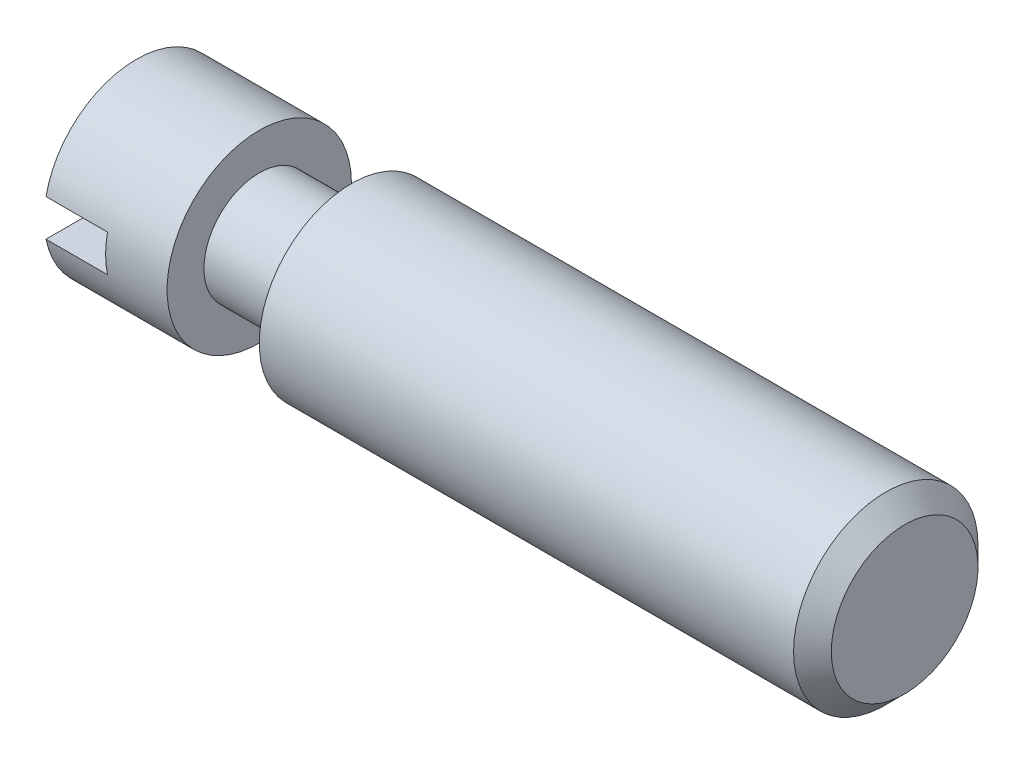
ISO-10303-21;
HEADER;
FILE_DESCRIPTION(('STEP AP214'),'2;1');
FILE_NAME('part.step','',(''),(''),'','','');
FILE_SCHEMA(('AUTOMOTIVE_DESIGN { 1 0 10303 214 1 1 1 1 }'));
ENDSEC;
DATA;
#1=APPLICATION_CONTEXT('core data for automotive mechanical design processes');
#2=APPLICATION_PROTOCOL_DEFINITION('international standard','automotive_design',2000,#1);
#3=PRODUCT_CONTEXT('',#1,'mechanical');
#4=PRODUCT('Part','Part','',(#3));
#5=PRODUCT_RELATED_PRODUCT_CATEGORY('part','',(#4));
#6=PRODUCT_DEFINITION_FORMATION('','',#4);
#7=PRODUCT_DEFINITION_CONTEXT('part definition',#1,'design');
#8=PRODUCT_DEFINITION('design','',#6,#7);
#9=PRODUCT_DEFINITION_SHAPE('','',#8);
#10=(LENGTH_UNIT() NAMED_UNIT(*) SI_UNIT(.MILLI.,.METRE.));
#11=(NAMED_UNIT(*) PLANE_ANGLE_UNIT() SI_UNIT($,.RADIAN.));
#12=(NAMED_UNIT(*) SI_UNIT($,.STERADIAN.) SOLID_ANGLE_UNIT());
#13=UNCERTAINTY_MEASURE_WITH_UNIT(LENGTH_MEASURE(1.E-05),#10,'distance_accuracy_value','');
#14=(GEOMETRIC_REPRESENTATION_CONTEXT(3) GLOBAL_UNCERTAINTY_ASSIGNED_CONTEXT((#13)) GLOBAL_UNIT_ASSIGNED_CONTEXT((#10,
#11,#12)) REPRESENTATION_CONTEXT('',''));
#15=CARTESIAN_POINT('',(0.,0.,0.));
#16=DIRECTION('',(0.,0.,1.));
#17=DIRECTION('',(1.,0.,0.));
#18=AXIS2_PLACEMENT_3D('',#15,#16,#17);
#19=CARTESIAN_POINT('',(2.,-0.6,3.));
#20=DIRECTION('',(1.,0.,0.));
#21=DIRECTION('',(0.,0.,-1.));
#22=AXIS2_PLACEMENT_3D('',#19,#20,#21);
#23=PLANE('',#22);
#24=DIRECTION('',(0.,0.,-1.));
#25=VECTOR('',#24,1.);
#26=CARTESIAN_POINT('',(2.,-0.6,3.));
#27=LINE('',#26,#25);
#28=CARTESIAN_POINT('',(2.,-0.600000000000001,-2.93938769133981));
#29=VERTEX_POINT('',#28);
#30=CARTESIAN_POINT('',(2.,-0.6,2.93938769133981));
#31=VERTEX_POINT('',#30);
#32=EDGE_CURVE('E60',#29,#31,#27,.F.);
#33=ORIENTED_EDGE('',*,*,#32,.T.);
#34=CARTESIAN_POINT('',(2.,0.,0.));
#35=DIRECTION('',(1.,0.,0.));
#36=DIRECTION('',(0.,0.,-1.));
#37=AXIS2_PLACEMENT_3D('',#34,#35,#36);
#38=CIRCLE('',#37,3.);
#39=CARTESIAN_POINT('',(2.,0.6,2.93938769133981));
#40=VERTEX_POINT('',#39);
#41=EDGE_CURVE('E19',#40,#31,#38,.T.);
#42=ORIENTED_EDGE('',*,*,#41,.F.);
#43=DIRECTION('',(0.,0.,1.));
#44=VECTOR('',#43,1.);
#45=CARTESIAN_POINT('',(2.,0.6,3.));
#46=LINE('',#45,#44);
#47=CARTESIAN_POINT('',(2.,0.6,-2.93938769133981));
#48=VERTEX_POINT('',#47);
#49=EDGE_CURVE('E57',#40,#48,#46,.F.);
#50=ORIENTED_EDGE('',*,*,#49,.T.);
#51=CARTESIAN_POINT('',(2.,0.,0.));
#52=DIRECTION('',(1.,0.,0.));
#53=DIRECTION('',(0.,0.,-1.));
#54=AXIS2_PLACEMENT_3D('',#51,#52,#53);
#55=CIRCLE('',#54,3.);
#56=EDGE_CURVE('E64',#29,#48,#55,.T.);
#57=ORIENTED_EDGE('',*,*,#56,.F.);
#58=EDGE_LOOP('',(#33,#42,#50,#57));
#59=FACE_BOUND('',#58,.T.);
#60=ADVANCED_FACE('F16',(#59),#23,.F.);
#61=CARTESIAN_POINT('',(0.,1.5,0.));
#62=DIRECTION('',(-1.,0.,0.));
#63=DIRECTION('',(0.,0.,1.));
#64=AXIS2_PLACEMENT_3D('',#61,#62,#63);
#65=PLANE('',#64);
#66=CARTESIAN_POINT('',(0.,0.,0.));
#67=DIRECTION('',(1.,0.,0.));
#68=DIRECTION('',(0.,0.,-1.));
#69=AXIS2_PLACEMENT_3D('',#66,#67,#68);
#70=CIRCLE('',#69,3.);
#71=CARTESIAN_POINT('',(0.,0.600000000000001,-2.93938769133981));
#72=VERTEX_POINT('',#71);
#73=CARTESIAN_POINT('',(0.,0.6,2.93938769133981));
#74=VERTEX_POINT('',#73);
#75=EDGE_CURVE('E77',#72,#74,#70,.T.);
#76=ORIENTED_EDGE('',*,*,#75,.F.);
#77=DIRECTION('',(0.,0.,1.));
#78=VECTOR('',#77,1.);
#79=CARTESIAN_POINT('',(0.,0.6,3.));
#80=LINE('',#79,#78);
#81=EDGE_CURVE('E73',#72,#74,#80,.T.);
#82=ORIENTED_EDGE('',*,*,#81,.T.);
#83=EDGE_LOOP('',(#76,#82));
#84=FACE_BOUND('',#83,.T.);
#85=ADVANCED_FACE('F204',(#84),#65,.T.);
#86=CARTESIAN_POINT('',(2.,0.6,3.));
#87=DIRECTION('',(0.,1.,0.));
#88=DIRECTION('',(0.,0.,1.));
#89=AXIS2_PLACEMENT_3D('',#86,#87,#88);
#90=PLANE('',#89);
#91=ORIENTED_EDGE('',*,*,#49,.F.);
#92=DIRECTION('',(1.,0.,0.));
#93=VECTOR('',#92,1.);
#94=CARTESIAN_POINT('',(12.19325,0.600000000000001,2.93938769133981));
#95=LINE('',#94,#93);
#96=EDGE_CURVE('E69',#74,#40,#95,.T.);
#97=ORIENTED_EDGE('',*,*,#96,.F.);
#98=ORIENTED_EDGE('',*,*,#81,.F.);
#99=DIRECTION('',(1.,0.,0.));
#100=VECTOR('',#99,1.);
#101=CARTESIAN_POINT('',(12.19325,0.600000000000001,-2.93938769133981));
#102=LINE('',#101,#100);
#103=EDGE_CURVE('E72',#48,#72,#102,.F.);
#104=ORIENTED_EDGE('',*,*,#103,.F.);
#105=EDGE_LOOP('',(#91,#97,#98,#104));
#106=FACE_BOUND('',#105,.T.);
#107=ADVANCED_FACE('F67',(#106),#90,.F.);
#108=CARTESIAN_POINT('',(0.,-0.6,3.));
#109=DIRECTION('',(0.,-1.,0.));
#110=DIRECTION('',(0.,0.,-1.));
#111=AXIS2_PLACEMENT_3D('',#108,#109,#110);
#112=PLANE('',#111);
#113=DIRECTION('',(0.,0.,1.));
#114=VECTOR('',#113,1.);
#115=CARTESIAN_POINT('',(0.,-0.6,0.));
#116=LINE('',#115,#114);
#117=CARTESIAN_POINT('',(0.,-0.6,2.93938769133981));
#118=VERTEX_POINT('',#117);
#119=CARTESIAN_POINT('',(0.,-0.6,-2.93938769133981));
#120=VERTEX_POINT('',#119);
#121=EDGE_CURVE('E33',#118,#120,#116,.F.);
#122=ORIENTED_EDGE('',*,*,#121,.F.);
#123=DIRECTION('',(1.,0.,0.));
#124=VECTOR('',#123,1.);
#125=CARTESIAN_POINT('',(12.19325,-0.6,2.93938769133981));
#126=LINE('',#125,#124);
#127=EDGE_CURVE('E78',#31,#118,#126,.F.);
#128=ORIENTED_EDGE('',*,*,#127,.F.);
#129=ORIENTED_EDGE('',*,*,#32,.F.);
#130=DIRECTION('',(1.,0.,0.));
#131=VECTOR('',#130,1.);
#132=CARTESIAN_POINT('',(12.19325,-0.600000000000001,-2.93938769133981));
#133=LINE('',#132,#131);
#134=EDGE_CURVE('E86',#120,#29,#133,.T.);
#135=ORIENTED_EDGE('',*,*,#134,.F.);
#136=EDGE_LOOP('',(#122,#128,#129,#135));
#137=FACE_BOUND('',#136,.T.);
#138=ADVANCED_FACE('F102',(#137),#112,.F.);
#139=CARTESIAN_POINT('',(0.,1.5,0.));
#140=DIRECTION('',(-1.,0.,0.));
#141=DIRECTION('',(0.,0.,1.));
#142=AXIS2_PLACEMENT_3D('',#139,#140,#141);
#143=PLANE('',#142);
#144=ORIENTED_EDGE('',*,*,#121,.T.);
#145=CARTESIAN_POINT('',(0.,0.,0.));
#146=DIRECTION('',(1.,0.,0.));
#147=DIRECTION('',(0.,0.,-1.));
#148=AXIS2_PLACEMENT_3D('',#145,#146,#147);
#149=CIRCLE('',#148,3.);
#150=EDGE_CURVE('E80',#118,#120,#149,.T.);
#151=ORIENTED_EDGE('',*,*,#150,.F.);
#152=EDGE_LOOP('',(#144,#151));
#153=FACE_BOUND('',#152,.T.);
#154=ADVANCED_FACE('F179',(#153),#143,.T.);
#155=CARTESIAN_POINT('',(12.19325,0.,0.));
#156=DIRECTION('',(1.,0.,0.));
#157=DIRECTION('',(0.,0.,-1.));
#158=AXIS2_PLACEMENT_3D('',#155,#156,#157);
#159=CYLINDRICAL_SURFACE('',#158,3.);
#160=ORIENTED_EDGE('',*,*,#103,.T.);
#161=ORIENTED_EDGE('',*,*,#75,.T.);
#162=ORIENTED_EDGE('',*,*,#96,.T.);
#163=ORIENTED_EDGE('',*,*,#41,.T.);
#164=ORIENTED_EDGE('',*,*,#127,.T.);
#165=ORIENTED_EDGE('',*,*,#150,.T.);
#166=ORIENTED_EDGE('',*,*,#134,.T.);
#167=ORIENTED_EDGE('',*,*,#56,.T.);
#168=EDGE_LOOP('',(#160,#161,#162,#163,#164,#165,#166,#167));
#169=FACE_BOUND('',#168,.T.);
#170=CARTESIAN_POINT('',(4.,0.,0.));
#171=DIRECTION('',(1.,0.,0.));
#172=DIRECTION('',(0.,0.,-1.));
#173=AXIS2_PLACEMENT_3D('',#170,#171,#172);
#174=CIRCLE('',#173,3.);
#175=CARTESIAN_POINT('',(4.,0.,-3.));
#176=VERTEX_POINT('',#175);
#177=EDGE_CURVE('E99',#176,#176,#174,.F.);
#178=ORIENTED_EDGE('',*,*,#177,.T.);
#179=EDGE_LOOP('',(#178));
#180=FACE_BOUND('',#179,.T.);
#181=ADVANCED_FACE('F75',(#169,#180),#159,.T.);
#182=CARTESIAN_POINT('',(4.,3.3,0.));
#183=DIRECTION('',(-1.,0.,0.));
#184=DIRECTION('',(0.,0.,1.));
#185=AXIS2_PLACEMENT_3D('',#182,#183,#184);
#186=PLANE('',#185);
#187=CARTESIAN_POINT('',(4.,0.,0.));
#188=DIRECTION('',(1.,0.,0.));
#189=DIRECTION('',(0.,0.,-1.));
#190=AXIS2_PLACEMENT_3D('',#187,#188,#189);
#191=CIRCLE('',#190,1.8);
#192=CARTESIAN_POINT('',(4.,0.,-1.8));
#193=VERTEX_POINT('',#192);
#194=EDGE_CURVE('E96',#193,#193,#191,.T.);
#195=ORIENTED_EDGE('',*,*,#194,.F.);
#196=EDGE_LOOP('',(#195));
#197=FACE_BOUND('',#196,.T.);
#198=ORIENTED_EDGE('',*,*,#177,.F.);
#199=EDGE_LOOP('',(#198));
#200=FACE_BOUND('',#199,.T.);
#201=ADVANCED_FACE('F160',(#197,#200),#186,.F.);
#202=CARTESIAN_POINT('',(25.,1.19325,0.));
#203=DIRECTION('',(1.,0.,0.));
#204=DIRECTION('',(0.,0.,-1.));
#205=AXIS2_PLACEMENT_3D('',#202,#203,#204);
#206=PLANE('',#205);
#207=CARTESIAN_POINT('',(24.9999999999204,0.,0.));
#208=DIRECTION('',(-1.,0.,0.));
#209=DIRECTION('',(0.,0.,1.));
#210=AXIS2_PLACEMENT_3D('',#207,#208,#209);
#211=CIRCLE('',#210,2.38650000000007);
#212=CARTESIAN_POINT('',(24.9999999999204,0.,2.38650000000007));
#213=VERTEX_POINT('',#212);
#214=EDGE_CURVE('E93',#213,#213,#211,.T.);
#215=ORIENTED_EDGE('',*,*,#214,.F.);
#216=EDGE_LOOP('',(#215));
#217=FACE_BOUND('',#216,.T.);
#218=ADVANCED_FACE('F125',(#217),#206,.T.);
#219=CARTESIAN_POINT('',(5.5,0.,0.));
#220=DIRECTION('',(1.,0.,0.));
#221=DIRECTION('',(0.,0.,-1.));
#222=AXIS2_PLACEMENT_3D('',#219,#220,#221);
#223=CYLINDRICAL_SURFACE('',#222,1.8);
#224=CARTESIAN_POINT('',(7.,0.,0.));
#225=DIRECTION('',(1.,0.,0.));
#226=DIRECTION('',(0.,0.,-1.));
#227=AXIS2_PLACEMENT_3D('',#224,#225,#226);
#228=CIRCLE('',#227,1.8);
#229=CARTESIAN_POINT('',(7.,0.,-1.8));
#230=VERTEX_POINT('',#229);
#231=EDGE_CURVE('E90',#230,#230,#228,.F.);
#232=ORIENTED_EDGE('',*,*,#231,.T.);
#233=EDGE_LOOP('',(#232));
#234=FACE_BOUND('',#233,.T.);
#235=ORIENTED_EDGE('',*,*,#194,.T.);
#236=EDGE_LOOP('',(#235));
#237=FACE_BOUND('',#236,.T.);
#238=ADVANCED_FACE('F115',(#234,#237),#223,.T.);
#239=CARTESIAN_POINT('',(24.3864999999914,0.,0.));
#240=DIRECTION('',(-1.,0.,0.));
#241=DIRECTION('',(0.,0.,1.));
#242=AXIS2_PLACEMENT_3D('',#239,#240,#241);
#243=CONICAL_SURFACE('',#242,2.9999999999859,0.785398163443775);
#244=ORIENTED_EDGE('',*,*,#214,.T.);
#245=EDGE_LOOP('',(#244));
#246=FACE_BOUND('',#245,.T.);
#247=CARTESIAN_POINT('',(24.3865,0.,0.));
#248=DIRECTION('',(1.,0.,0.));
#249=DIRECTION('',(0.,0.,-1.));
#250=AXIS2_PLACEMENT_3D('',#247,#248,#249);
#251=CIRCLE('',#250,3.);
#252=CARTESIAN_POINT('',(24.3865,0.,-3.));
#253=VERTEX_POINT('',#252);
#254=EDGE_CURVE('E25',#253,#253,#251,.F.);
#255=ORIENTED_EDGE('',*,*,#254,.F.);
#256=EDGE_LOOP('',(#255));
#257=FACE_BOUND('',#256,.T.);
#258=ADVANCED_FACE('F112',(#246,#257),#243,.T.);
#259=CARTESIAN_POINT('',(7.,3.3,0.));
#260=DIRECTION('',(1.,0.,0.));
#261=DIRECTION('',(0.,0.,-1.));
#262=AXIS2_PLACEMENT_3D('',#259,#260,#261);
#263=PLANE('',#262);
#264=ORIENTED_EDGE('',*,*,#231,.F.);
#265=EDGE_LOOP('',(#264));
#266=FACE_BOUND('',#265,.T.);
#267=CARTESIAN_POINT('',(7.,0.,0.));
#268=DIRECTION('',(1.,0.,0.));
#269=DIRECTION('',(0.,0.,-1.));
#270=AXIS2_PLACEMENT_3D('',#267,#268,#269);
#271=CIRCLE('',#270,3.);
#272=CARTESIAN_POINT('',(7.,0.,-3.));
#273=VERTEX_POINT('',#272);
#274=EDGE_CURVE('E11',#273,#273,#271,.T.);
#275=ORIENTED_EDGE('',*,*,#274,.F.);
#276=EDGE_LOOP('',(#275));
#277=FACE_BOUND('',#276,.T.);
#278=ADVANCED_FACE('F114',(#266,#277),#263,.F.);
#279=CARTESIAN_POINT('',(12.19325,0.,0.));
#280=DIRECTION('',(1.,0.,0.));
#281=DIRECTION('',(0.,0.,-1.));
#282=AXIS2_PLACEMENT_3D('',#279,#280,#281);
#283=CYLINDRICAL_SURFACE('',#282,3.);
#284=ORIENTED_EDGE('',*,*,#254,.T.);
#285=EDGE_LOOP('',(#284));
#286=FACE_BOUND('',#285,.T.);
#287=ORIENTED_EDGE('',*,*,#274,.T.);
#288=EDGE_LOOP('',(#287));
#289=FACE_BOUND('',#288,.T.);
#290=ADVANCED_FACE('F109',(#286,#289),#283,.T.);
#291=CLOSED_SHELL('',(#60,#85,#107,#138,#154,#181,#201,#218,#238,#258,#278,#290));
#292=MANIFOLD_SOLID_BREP('B1',#291);
#293=ADVANCED_BREP_SHAPE_REPRESENTATION('',(#18,#292),#14);
#294=SHAPE_DEFINITION_REPRESENTATION(#9,#293);
ENDSEC;
END-ISO-10303-21;
